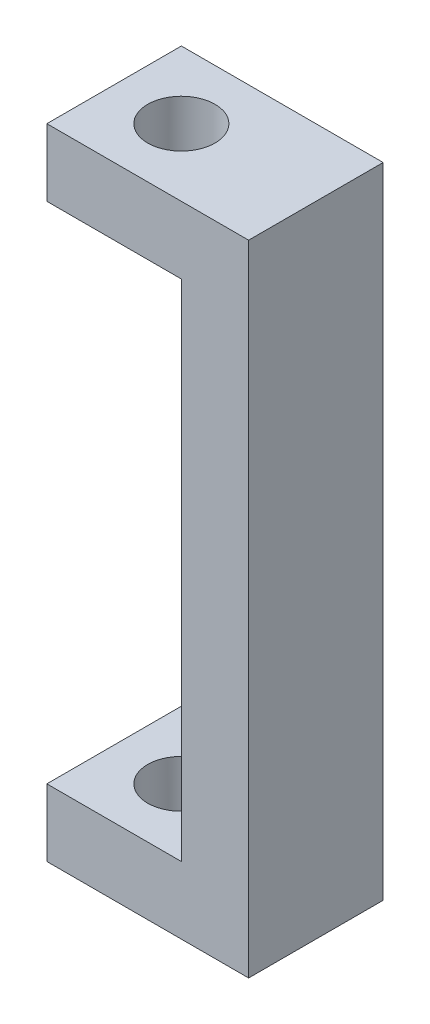
ISO-10303-21;
HEADER;
FILE_DESCRIPTION(('STEP AP214'),'2;1');
FILE_NAME('part.step','',(''),(''),'','','');
FILE_SCHEMA(('AUTOMOTIVE_DESIGN { 1 0 10303 214 1 1 1 1 }'));
ENDSEC;
DATA;
#1=APPLICATION_CONTEXT('core data for automotive mechanical design processes');
#2=APPLICATION_PROTOCOL_DEFINITION('international standard','automotive_design',2000,#1);
#3=PRODUCT_CONTEXT('',#1,'mechanical');
#4=PRODUCT('Part','Part','',(#3));
#5=PRODUCT_RELATED_PRODUCT_CATEGORY('part','',(#4));
#6=PRODUCT_DEFINITION_FORMATION('','',#4);
#7=PRODUCT_DEFINITION_CONTEXT('part definition',#1,'design');
#8=PRODUCT_DEFINITION('design','',#6,#7);
#9=PRODUCT_DEFINITION_SHAPE('','',#8);
#10=(LENGTH_UNIT() NAMED_UNIT(*) SI_UNIT(.MILLI.,.METRE.));
#11=(NAMED_UNIT(*) PLANE_ANGLE_UNIT() SI_UNIT($,.RADIAN.));
#12=(NAMED_UNIT(*) SI_UNIT($,.STERADIAN.) SOLID_ANGLE_UNIT());
#13=UNCERTAINTY_MEASURE_WITH_UNIT(LENGTH_MEASURE(1.E-05),#10,'distance_accuracy_value','');
#14=(GEOMETRIC_REPRESENTATION_CONTEXT(3) GLOBAL_UNCERTAINTY_ASSIGNED_CONTEXT((#13)) GLOBAL_UNIT_ASSIGNED_CONTEXT((#10,
#11,#12)) REPRESENTATION_CONTEXT('',''));
#15=CARTESIAN_POINT('',(0.,0.,0.));
#16=DIRECTION('',(0.,0.,1.));
#17=DIRECTION('',(1.,0.,0.));
#18=AXIS2_PLACEMENT_3D('',#15,#16,#17);
#19=CARTESIAN_POINT('',(0.,-4.,8.));
#20=DIRECTION('',(1.,0.,0.));
#21=DIRECTION('',(0.,0.,-1.));
#22=AXIS2_PLACEMENT_3D('',#19,#20,#21);
#23=PLANE('',#22);
#24=DIRECTION('',(0.,-1.,0.));
#25=VECTOR('',#24,1.);
#26=CARTESIAN_POINT('',(0.,-4.,0.));
#27=LINE('',#26,#25);
#28=CARTESIAN_POINT('',(0.,0.,0.));
#29=VERTEX_POINT('',#28);
#30=CARTESIAN_POINT('',(0.,-4.,0.));
#31=VERTEX_POINT('',#30);
#32=EDGE_CURVE('E142',#29,#31,#27,.T.);
#33=ORIENTED_EDGE('',*,*,#32,.T.);
#34=DIRECTION('',(0.,0.,-1.));
#35=VECTOR('',#34,1.);
#36=CARTESIAN_POINT('',(0.,-4.,8.));
#37=LINE('',#36,#35);
#38=CARTESIAN_POINT('',(0.,-4.,8.));
#39=VERTEX_POINT('',#38);
#40=EDGE_CURVE('E11',#39,#31,#37,.T.);
#41=ORIENTED_EDGE('',*,*,#40,.F.);
#42=DIRECTION('',(0.,-1.,0.));
#43=VECTOR('',#42,1.);
#44=CARTESIAN_POINT('',(0.,-4.,8.));
#45=LINE('',#44,#43);
#46=CARTESIAN_POINT('',(0.,0.,8.));
#47=VERTEX_POINT('',#46);
#48=EDGE_CURVE('E165',#47,#39,#45,.T.);
#49=ORIENTED_EDGE('',*,*,#48,.F.);
#50=DIRECTION('',(0.,0.,-1.));
#51=VECTOR('',#50,1.);
#52=CARTESIAN_POINT('',(0.,0.,8.));
#53=LINE('',#52,#51);
#54=EDGE_CURVE('E138',#47,#29,#53,.T.);
#55=ORIENTED_EDGE('',*,*,#54,.T.);
#56=EDGE_LOOP('',(#33,#41,#49,#55));
#57=FACE_BOUND('',#56,.T.);
#58=ADVANCED_FACE('F41',(#57),#23,.F.);
#59=CARTESIAN_POINT('',(8.,-4.,8.));
#60=DIRECTION('',(0.,1.,0.));
#61=DIRECTION('',(-1.,0.,0.));
#62=AXIS2_PLACEMENT_3D('',#59,#60,#61);
#63=PLANE('',#62);
#64=CARTESIAN_POINT('',(4.,-4.,4.));
#65=DIRECTION('',(0.,1.,0.));
#66=DIRECTION('',(-1.,0.,0.));
#67=AXIS2_PLACEMENT_3D('',#64,#65,#66);
#68=CIRCLE('',#67,2.);
#69=CARTESIAN_POINT('',(2.,-4.,4.));
#70=VERTEX_POINT('',#69);
#71=EDGE_CURVE('E147',#70,#70,#68,.T.);
#72=ORIENTED_EDGE('',*,*,#71,.T.);
#73=EDGE_LOOP('',(#72));
#74=FACE_BOUND('',#73,.T.);
#75=DIRECTION('',(1.,0.,0.));
#76=VECTOR('',#75,1.);
#77=CARTESIAN_POINT('',(8.,-4.,0.));
#78=LINE('',#77,#76);
#79=CARTESIAN_POINT('',(8.,-4.,0.));
#80=VERTEX_POINT('',#79);
#81=EDGE_CURVE('E146',#31,#80,#78,.T.);
#82=ORIENTED_EDGE('',*,*,#81,.T.);
#83=DIRECTION('',(0.,0.,-1.));
#84=VECTOR('',#83,1.);
#85=CARTESIAN_POINT('',(8.,-4.,8.));
#86=LINE('',#85,#84);
#87=CARTESIAN_POINT('',(8.,-4.,8.));
#88=VERTEX_POINT('',#87);
#89=EDGE_CURVE('E50',#88,#80,#86,.T.);
#90=ORIENTED_EDGE('',*,*,#89,.F.);
#91=DIRECTION('',(1.,0.,0.));
#92=VECTOR('',#91,1.);
#93=CARTESIAN_POINT('',(8.,-4.,8.));
#94=LINE('',#93,#92);
#95=EDGE_CURVE('E101',#39,#88,#94,.T.);
#96=ORIENTED_EDGE('',*,*,#95,.F.);
#97=ORIENTED_EDGE('',*,*,#40,.T.);
#98=EDGE_LOOP('',(#82,#90,#96,#97));
#99=FACE_BOUND('',#98,.T.);
#100=ADVANCED_FACE('F240',(#74,#99),#63,.F.);
#101=CARTESIAN_POINT('',(8.,-34.,8.));
#102=DIRECTION('',(1.,0.,0.));
#103=DIRECTION('',(0.,1.,0.));
#104=AXIS2_PLACEMENT_3D('',#101,#102,#103);
#105=PLANE('',#104);
#106=DIRECTION('',(0.,-1.,0.));
#107=VECTOR('',#106,1.);
#108=CARTESIAN_POINT('',(8.,-34.,0.));
#109=LINE('',#108,#107);
#110=CARTESIAN_POINT('',(8.,-34.,0.));
#111=VERTEX_POINT('',#110);
#112=EDGE_CURVE('E150',#80,#111,#109,.T.);
#113=ORIENTED_EDGE('',*,*,#112,.T.);
#114=DIRECTION('',(0.,0.,-1.));
#115=VECTOR('',#114,1.);
#116=CARTESIAN_POINT('',(8.,-34.,8.));
#117=LINE('',#116,#115);
#118=CARTESIAN_POINT('',(8.,-34.,8.));
#119=VERTEX_POINT('',#118);
#120=EDGE_CURVE('E176',#119,#111,#117,.T.);
#121=ORIENTED_EDGE('',*,*,#120,.F.);
#122=DIRECTION('',(0.,-1.,0.));
#123=VECTOR('',#122,1.);
#124=CARTESIAN_POINT('',(8.,-34.,8.));
#125=LINE('',#124,#123);
#126=EDGE_CURVE('E186',#88,#119,#125,.T.);
#127=ORIENTED_EDGE('',*,*,#126,.F.);
#128=ORIENTED_EDGE('',*,*,#89,.T.);
#129=EDGE_LOOP('',(#113,#121,#127,#128));
#130=FACE_BOUND('',#129,.T.);
#131=ADVANCED_FACE('F184',(#130),#105,.F.);
#132=CARTESIAN_POINT('',(0.,-34.,8.));
#133=DIRECTION('',(0.,-1.,0.));
#134=DIRECTION('',(0.,0.,-1.));
#135=AXIS2_PLACEMENT_3D('',#132,#133,#134);
#136=PLANE('',#135);
#137=CARTESIAN_POINT('',(4.,-34.,4.));
#138=DIRECTION('',(0.,-1.,0.));
#139=DIRECTION('',(0.,0.,-1.));
#140=AXIS2_PLACEMENT_3D('',#137,#138,#139);
#141=CIRCLE('',#140,2.);
#142=CARTESIAN_POINT('',(4.,-34.,2.));
#143=VERTEX_POINT('',#142);
#144=EDGE_CURVE('E212',#143,#143,#141,.T.);
#145=ORIENTED_EDGE('',*,*,#144,.T.);
#146=EDGE_LOOP('',(#145));
#147=FACE_BOUND('',#146,.T.);
#148=DIRECTION('',(-1.,0.,0.));
#149=VECTOR('',#148,1.);
#150=CARTESIAN_POINT('',(0.,-34.,0.));
#151=LINE('',#150,#149);
#152=CARTESIAN_POINT('',(0.,-34.,0.));
#153=VERTEX_POINT('',#152);
#154=EDGE_CURVE('E153',#111,#153,#151,.T.);
#155=ORIENTED_EDGE('',*,*,#154,.T.);
#156=DIRECTION('',(0.,0.,-1.));
#157=VECTOR('',#156,1.);
#158=CARTESIAN_POINT('',(0.,-34.,8.));
#159=LINE('',#158,#157);
#160=CARTESIAN_POINT('',(0.,-34.,8.));
#161=VERTEX_POINT('',#160);
#162=EDGE_CURVE('E172',#161,#153,#159,.T.);
#163=ORIENTED_EDGE('',*,*,#162,.F.);
#164=DIRECTION('',(-1.,0.,0.));
#165=VECTOR('',#164,1.);
#166=CARTESIAN_POINT('',(0.,-34.,8.));
#167=LINE('',#166,#165);
#168=EDGE_CURVE('E199',#119,#161,#167,.T.);
#169=ORIENTED_EDGE('',*,*,#168,.F.);
#170=ORIENTED_EDGE('',*,*,#120,.T.);
#171=EDGE_LOOP('',(#155,#163,#169,#170));
#172=FACE_BOUND('',#171,.T.);
#173=ADVANCED_FACE('F194',(#147,#172),#136,.F.);
#174=CARTESIAN_POINT('',(0.,-38.,8.));
#175=DIRECTION('',(1.,0.,0.));
#176=DIRECTION('',(0.,0.,-1.));
#177=AXIS2_PLACEMENT_3D('',#174,#175,#176);
#178=PLANE('',#177);
#179=DIRECTION('',(0.,-1.,0.));
#180=VECTOR('',#179,1.);
#181=CARTESIAN_POINT('',(0.,-38.,0.));
#182=LINE('',#181,#180);
#183=CARTESIAN_POINT('',(0.,-38.,0.));
#184=VERTEX_POINT('',#183);
#185=EDGE_CURVE('E156',#153,#184,#182,.T.);
#186=ORIENTED_EDGE('',*,*,#185,.T.);
#187=DIRECTION('',(0.,0.,-1.));
#188=VECTOR('',#187,1.);
#189=CARTESIAN_POINT('',(0.,-38.,8.));
#190=LINE('',#189,#188);
#191=CARTESIAN_POINT('',(0.,-38.,8.));
#192=VERTEX_POINT('',#191);
#193=EDGE_CURVE('E131',#192,#184,#190,.T.);
#194=ORIENTED_EDGE('',*,*,#193,.F.);
#195=DIRECTION('',(0.,-1.,0.));
#196=VECTOR('',#195,1.);
#197=CARTESIAN_POINT('',(0.,-38.,8.));
#198=LINE('',#197,#196);
#199=EDGE_CURVE('E120',#161,#192,#198,.T.);
#200=ORIENTED_EDGE('',*,*,#199,.F.);
#201=ORIENTED_EDGE('',*,*,#162,.T.);
#202=EDGE_LOOP('',(#186,#194,#200,#201));
#203=FACE_BOUND('',#202,.T.);
#204=ADVANCED_FACE('F197',(#203),#178,.F.);
#205=CARTESIAN_POINT('',(12.,-38.,8.));
#206=DIRECTION('',(0.,1.,0.));
#207=DIRECTION('',(0.,0.,1.));
#208=AXIS2_PLACEMENT_3D('',#205,#206,#207);
#209=PLANE('',#208);
#210=CARTESIAN_POINT('',(4.,-38.,4.));
#211=DIRECTION('',(0.,1.,0.));
#212=DIRECTION('',(0.,0.,1.));
#213=AXIS2_PLACEMENT_3D('',#210,#211,#212);
#214=CIRCLE('',#213,2.);
#215=CARTESIAN_POINT('',(4.,-38.,6.));
#216=VERTEX_POINT('',#215);
#217=EDGE_CURVE('E216',#216,#216,#214,.T.);
#218=ORIENTED_EDGE('',*,*,#217,.T.);
#219=EDGE_LOOP('',(#218));
#220=FACE_BOUND('',#219,.T.);
#221=DIRECTION('',(1.,0.,0.));
#222=VECTOR('',#221,1.);
#223=CARTESIAN_POINT('',(12.,-38.,0.));
#224=LINE('',#223,#222);
#225=CARTESIAN_POINT('',(12.,-38.,0.));
#226=VERTEX_POINT('',#225);
#227=EDGE_CURVE('E129',#184,#226,#224,.T.);
#228=ORIENTED_EDGE('',*,*,#227,.T.);
#229=DIRECTION('',(0.,0.,-1.));
#230=VECTOR('',#229,1.);
#231=CARTESIAN_POINT('',(12.,-38.,8.));
#232=LINE('',#231,#230);
#233=CARTESIAN_POINT('',(12.,-38.,8.));
#234=VERTEX_POINT('',#233);
#235=EDGE_CURVE('E126',#234,#226,#232,.T.);
#236=ORIENTED_EDGE('',*,*,#235,.F.);
#237=DIRECTION('',(1.,0.,0.));
#238=VECTOR('',#237,1.);
#239=CARTESIAN_POINT('',(12.,-38.,8.));
#240=LINE('',#239,#238);
#241=EDGE_CURVE('E114',#192,#234,#240,.T.);
#242=ORIENTED_EDGE('',*,*,#241,.F.);
#243=ORIENTED_EDGE('',*,*,#193,.T.);
#244=EDGE_LOOP('',(#228,#236,#242,#243));
#245=FACE_BOUND('',#244,.T.);
#246=ADVANCED_FACE('F127',(#220,#245),#209,.F.);
#247=CARTESIAN_POINT('',(12.,0.,8.));
#248=DIRECTION('',(-1.,0.,0.));
#249=DIRECTION('',(0.,-1.,0.));
#250=AXIS2_PLACEMENT_3D('',#247,#248,#249);
#251=PLANE('',#250);
#252=DIRECTION('',(0.,1.,0.));
#253=VECTOR('',#252,1.);
#254=CARTESIAN_POINT('',(12.,0.,0.));
#255=LINE('',#254,#253);
#256=CARTESIAN_POINT('',(12.,0.,0.));
#257=VERTEX_POINT('',#256);
#258=EDGE_CURVE('E87',#226,#257,#255,.T.);
#259=ORIENTED_EDGE('',*,*,#258,.T.);
#260=DIRECTION('',(0.,0.,-1.));
#261=VECTOR('',#260,1.);
#262=CARTESIAN_POINT('',(12.,0.,8.));
#263=LINE('',#262,#261);
#264=CARTESIAN_POINT('',(12.,0.,8.));
#265=VERTEX_POINT('',#264);
#266=EDGE_CURVE('E132',#265,#257,#263,.T.);
#267=ORIENTED_EDGE('',*,*,#266,.F.);
#268=DIRECTION('',(0.,1.,0.));
#269=VECTOR('',#268,1.);
#270=CARTESIAN_POINT('',(12.,0.,8.));
#271=LINE('',#270,#269);
#272=EDGE_CURVE('E118',#234,#265,#271,.T.);
#273=ORIENTED_EDGE('',*,*,#272,.F.);
#274=ORIENTED_EDGE('',*,*,#235,.T.);
#275=EDGE_LOOP('',(#259,#267,#273,#274));
#276=FACE_BOUND('',#275,.T.);
#277=ADVANCED_FACE('F134',(#276),#251,.F.);
#278=CARTESIAN_POINT('',(0.,0.,8.));
#279=DIRECTION('',(0.,-1.,0.));
#280=DIRECTION('',(0.,0.,-1.));
#281=AXIS2_PLACEMENT_3D('',#278,#279,#280);
#282=PLANE('',#281);
#283=CARTESIAN_POINT('',(4.,0.,4.));
#284=DIRECTION('',(0.,1.,0.));
#285=DIRECTION('',(0.,0.,1.));
#286=AXIS2_PLACEMENT_3D('',#283,#284,#285);
#287=CIRCLE('',#286,2.);
#288=CARTESIAN_POINT('',(4.,0.,6.));
#289=VERTEX_POINT('',#288);
#290=EDGE_CURVE('E217',#289,#289,#287,.T.);
#291=ORIENTED_EDGE('',*,*,#290,.F.);
#292=EDGE_LOOP('',(#291));
#293=FACE_BOUND('',#292,.T.);
#294=DIRECTION('',(-1.,0.,0.));
#295=VECTOR('',#294,1.);
#296=CARTESIAN_POINT('',(0.,0.,0.));
#297=LINE('',#296,#295);
#298=EDGE_CURVE('E93',#257,#29,#297,.T.);
#299=ORIENTED_EDGE('',*,*,#298,.T.);
#300=ORIENTED_EDGE('',*,*,#54,.F.);
#301=DIRECTION('',(-1.,0.,0.));
#302=VECTOR('',#301,1.);
#303=CARTESIAN_POINT('',(0.,0.,8.));
#304=LINE('',#303,#302);
#305=EDGE_CURVE('E58',#265,#47,#304,.T.);
#306=ORIENTED_EDGE('',*,*,#305,.F.);
#307=ORIENTED_EDGE('',*,*,#266,.T.);
#308=EDGE_LOOP('',(#299,#300,#306,#307));
#309=FACE_BOUND('',#308,.T.);
#310=ADVANCED_FACE('F250',(#293,#309),#282,.F.);
#311=CARTESIAN_POINT('',(0.,0.,8.));
#312=DIRECTION('',(0.,0.,-1.));
#313=DIRECTION('',(-1.,0.,0.));
#314=AXIS2_PLACEMENT_3D('',#311,#312,#313);
#315=PLANE('',#314);
#316=ORIENTED_EDGE('',*,*,#48,.T.);
#317=ORIENTED_EDGE('',*,*,#95,.T.);
#318=ORIENTED_EDGE('',*,*,#126,.T.);
#319=ORIENTED_EDGE('',*,*,#168,.T.);
#320=ORIENTED_EDGE('',*,*,#199,.T.);
#321=ORIENTED_EDGE('',*,*,#241,.T.);
#322=ORIENTED_EDGE('',*,*,#272,.T.);
#323=ORIENTED_EDGE('',*,*,#305,.T.);
#324=EDGE_LOOP('',(#316,#317,#318,#319,#320,#321,#322,#323));
#325=FACE_BOUND('',#324,.T.);
#326=ADVANCED_FACE('F116',(#325),#315,.F.);
#327=CARTESIAN_POINT('',(0.,0.,0.));
#328=DIRECTION('',(0.,0.,-1.));
#329=DIRECTION('',(-1.,0.,0.));
#330=AXIS2_PLACEMENT_3D('',#327,#328,#329);
#331=PLANE('',#330);
#332=ORIENTED_EDGE('',*,*,#32,.F.);
#333=ORIENTED_EDGE('',*,*,#298,.F.);
#334=ORIENTED_EDGE('',*,*,#258,.F.);
#335=ORIENTED_EDGE('',*,*,#227,.F.);
#336=ORIENTED_EDGE('',*,*,#185,.F.);
#337=ORIENTED_EDGE('',*,*,#154,.F.);
#338=ORIENTED_EDGE('',*,*,#112,.F.);
#339=ORIENTED_EDGE('',*,*,#81,.F.);
#340=EDGE_LOOP('',(#332,#333,#334,#335,#336,#337,#338,#339));
#341=FACE_BOUND('',#340,.T.);
#342=ADVANCED_FACE('F190',(#341),#331,.T.);
#343=CARTESIAN_POINT('',(4.,-38.,4.));
#344=DIRECTION('',(0.,1.,0.));
#345=DIRECTION('',(0.,0.,1.));
#346=AXIS2_PLACEMENT_3D('',#343,#344,#345);
#347=CYLINDRICAL_SURFACE('',#346,2.);
#348=ORIENTED_EDGE('',*,*,#290,.T.);
#349=EDGE_LOOP('',(#348));
#350=FACE_BOUND('',#349,.T.);
#351=ORIENTED_EDGE('',*,*,#71,.F.);
#352=EDGE_LOOP('',(#351));
#353=FACE_BOUND('',#352,.T.);
#354=ADVANCED_FACE('F229',(#350,#353),#347,.F.);
#355=ORIENTED_EDGE('',*,*,#217,.F.);
#356=EDGE_LOOP('',(#355));
#357=FACE_BOUND('',#356,.T.);
#358=ORIENTED_EDGE('',*,*,#144,.F.);
#359=EDGE_LOOP('',(#358));
#360=FACE_BOUND('',#359,.T.);
#361=ADVANCED_FACE('F226',(#357,#360),#347,.F.);
#362=CLOSED_SHELL('',(#58,#100,#131,#173,#204,#246,#277,#310,#326,#342,#354,#361));
#363=MANIFOLD_SOLID_BREP('B2',#362);
#364=ADVANCED_BREP_SHAPE_REPRESENTATION('',(#18,#363),#14);
#365=SHAPE_DEFINITION_REPRESENTATION(#9,#364);
ENDSEC;
END-ISO-10303-21;
